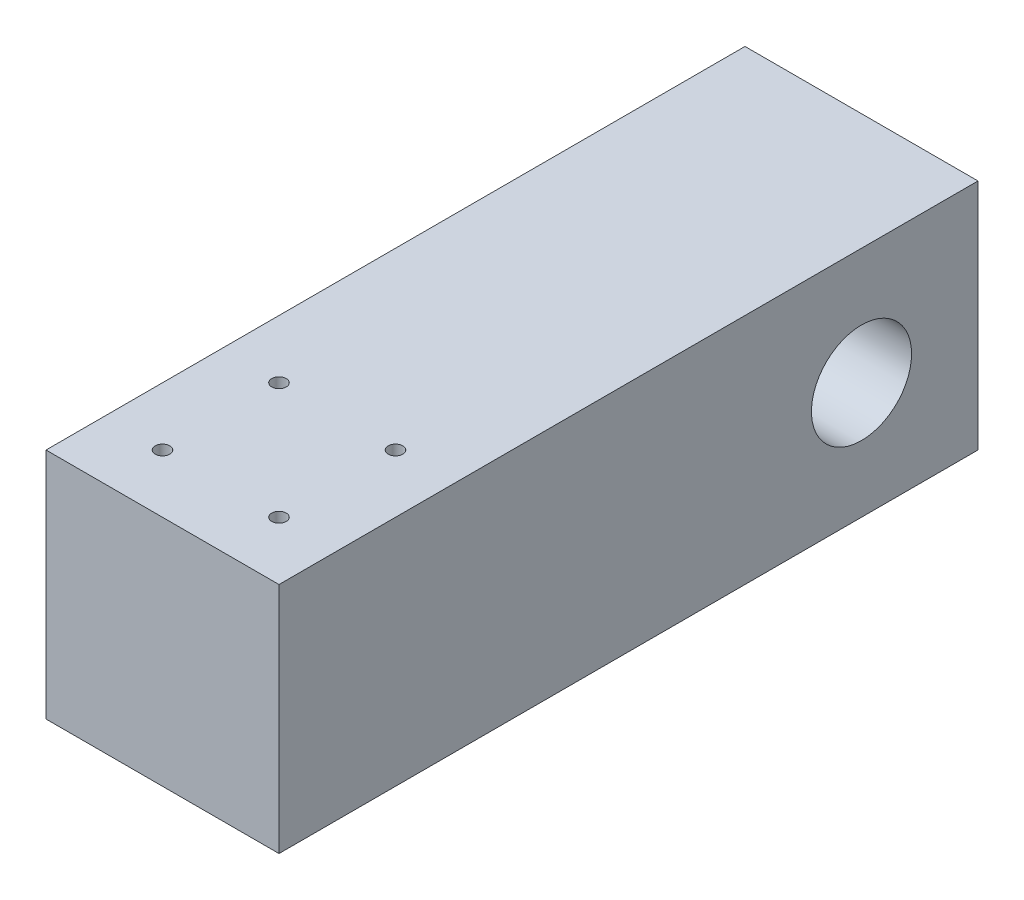
ISO-10303-21;
HEADER;
FILE_DESCRIPTION(('STEP AP214'),'2;1');
FILE_NAME('part.step','',(''),(''),'','','');
FILE_SCHEMA(('AUTOMOTIVE_DESIGN { 1 0 10303 214 1 1 1 1 }'));
ENDSEC;
DATA;
#1=APPLICATION_CONTEXT('core data for automotive mechanical design processes');
#2=APPLICATION_PROTOCOL_DEFINITION('international standard','automotive_design',2000,#1);
#3=PRODUCT_CONTEXT('',#1,'mechanical');
#4=PRODUCT('Part','Part','',(#3));
#5=PRODUCT_RELATED_PRODUCT_CATEGORY('part','',(#4));
#6=PRODUCT_DEFINITION_FORMATION('','',#4);
#7=PRODUCT_DEFINITION_CONTEXT('part definition',#1,'design');
#8=PRODUCT_DEFINITION('design','',#6,#7);
#9=PRODUCT_DEFINITION_SHAPE('','',#8);
#10=(LENGTH_UNIT() NAMED_UNIT(*) SI_UNIT(.MILLI.,.METRE.));
#11=(NAMED_UNIT(*) PLANE_ANGLE_UNIT() SI_UNIT($,.RADIAN.));
#12=(NAMED_UNIT(*) SI_UNIT($,.STERADIAN.) SOLID_ANGLE_UNIT());
#13=UNCERTAINTY_MEASURE_WITH_UNIT(LENGTH_MEASURE(1.E-05),#10,'distance_accuracy_value','');
#14=(GEOMETRIC_REPRESENTATION_CONTEXT(3) GLOBAL_UNCERTAINTY_ASSIGNED_CONTEXT((#13)) GLOBAL_UNIT_ASSIGNED_CONTEXT((#10,
#11,#12)) REPRESENTATION_CONTEXT('',''));
#15=CARTESIAN_POINT('',(0.,0.,0.));
#16=DIRECTION('',(0.,0.,1.));
#17=DIRECTION('',(1.,0.,0.));
#18=AXIS2_PLACEMENT_3D('',#15,#16,#17);
#19=CARTESIAN_POINT('',(50.8,0.,0.));
#20=DIRECTION('',(0.,0.,-1.));
#21=DIRECTION('',(-1.,0.,0.));
#22=AXIS2_PLACEMENT_3D('',#19,#20,#21);
#23=PLANE('',#22);
#24=DIRECTION('',(0.,-1.,0.));
#25=VECTOR('',#24,1.);
#26=CARTESIAN_POINT('',(0.,0.,0.));
#27=LINE('',#26,#25);
#28=CARTESIAN_POINT('',(0.,50.8,0.));
#29=VERTEX_POINT('',#28);
#30=CARTESIAN_POINT('',(0.,0.,0.));
#31=VERTEX_POINT('',#30);
#32=EDGE_CURVE('E99',#29,#31,#27,.T.);
#33=ORIENTED_EDGE('',*,*,#32,.T.);
#34=DIRECTION('',(-1.,0.,0.));
#35=VECTOR('',#34,1.);
#36=CARTESIAN_POINT('',(50.8,0.,0.));
#37=LINE('',#36,#35);
#38=CARTESIAN_POINT('',(50.8,0.,0.));
#39=VERTEX_POINT('',#38);
#40=EDGE_CURVE('E11',#39,#31,#37,.T.);
#41=ORIENTED_EDGE('',*,*,#40,.F.);
#42=DIRECTION('',(0.,-1.,0.));
#43=VECTOR('',#42,1.);
#44=CARTESIAN_POINT('',(50.8,0.,0.));
#45=LINE('',#44,#43);
#46=CARTESIAN_POINT('',(50.8,50.8,0.));
#47=VERTEX_POINT('',#46);
#48=EDGE_CURVE('E87',#47,#39,#45,.T.);
#49=ORIENTED_EDGE('',*,*,#48,.F.);
#50=DIRECTION('',(-1.,0.,0.));
#51=VECTOR('',#50,1.);
#52=CARTESIAN_POINT('',(50.8,50.8,0.));
#53=LINE('',#52,#51);
#54=EDGE_CURVE('E95',#47,#29,#53,.T.);
#55=ORIENTED_EDGE('',*,*,#54,.T.);
#56=EDGE_LOOP('',(#33,#41,#49,#55));
#57=FACE_BOUND('',#56,.T.);
#58=ADVANCED_FACE('F36',(#57),#23,.F.);
#59=CARTESIAN_POINT('',(50.8,0.,0.));
#60=DIRECTION('',(0.,1.,0.));
#61=DIRECTION('',(0.,0.,1.));
#62=AXIS2_PLACEMENT_3D('',#59,#60,#61);
#63=PLANE('',#62);
#64=CARTESIAN_POINT('',(38.1,0.,-38.1));
#65=DIRECTION('',(0.,1.,0.));
#66=DIRECTION('',(0.,0.,1.));
#67=AXIS2_PLACEMENT_3D('',#64,#65,#66);
#68=CIRCLE('',#67,1.5875);
#69=CARTESIAN_POINT('',(38.1,0.,-36.5125));
#70=VERTEX_POINT('',#69);
#71=EDGE_CURVE('E122',#70,#70,#68,.T.);
#72=ORIENTED_EDGE('',*,*,#71,.T.);
#73=EDGE_LOOP('',(#72));
#74=FACE_BOUND('',#73,.T.);
#75=CARTESIAN_POINT('',(12.7,0.,-12.7));
#76=DIRECTION('',(0.,1.,0.));
#77=DIRECTION('',(0.,0.,1.));
#78=AXIS2_PLACEMENT_3D('',#75,#76,#77);
#79=CIRCLE('',#78,1.5875);
#80=CARTESIAN_POINT('',(12.7,0.,-11.1125));
#81=VERTEX_POINT('',#80);
#82=EDGE_CURVE('E128',#81,#81,#79,.T.);
#83=ORIENTED_EDGE('',*,*,#82,.T.);
#84=EDGE_LOOP('',(#83));
#85=FACE_BOUND('',#84,.T.);
#86=CARTESIAN_POINT('',(38.1,0.,-12.7));
#87=DIRECTION('',(0.,1.,0.));
#88=DIRECTION('',(0.,0.,1.));
#89=AXIS2_PLACEMENT_3D('',#86,#87,#88);
#90=CIRCLE('',#89,1.5875);
#91=CARTESIAN_POINT('',(38.1,0.,-11.1125));
#92=VERTEX_POINT('',#91);
#93=EDGE_CURVE('E129',#92,#92,#90,.T.);
#94=ORIENTED_EDGE('',*,*,#93,.T.);
#95=EDGE_LOOP('',(#94));
#96=FACE_BOUND('',#95,.T.);
#97=CARTESIAN_POINT('',(12.7,0.,-38.1));
#98=DIRECTION('',(0.,1.,0.));
#99=DIRECTION('',(0.,0.,1.));
#100=AXIS2_PLACEMENT_3D('',#97,#98,#99);
#101=CIRCLE('',#100,1.5875);
#102=CARTESIAN_POINT('',(12.7,0.,-36.5125));
#103=VERTEX_POINT('',#102);
#104=EDGE_CURVE('E116',#103,#103,#101,.T.);
#105=ORIENTED_EDGE('',*,*,#104,.T.);
#106=EDGE_LOOP('',(#105));
#107=FACE_BOUND('',#106,.T.);
#108=DIRECTION('',(0.,0.,-1.));
#109=VECTOR('',#108,1.);
#110=CARTESIAN_POINT('',(0.,0.,0.));
#111=LINE('',#110,#109);
#112=CARTESIAN_POINT('',(0.,0.,-152.4));
#113=VERTEX_POINT('',#112);
#114=EDGE_CURVE('E91',#31,#113,#111,.T.);
#115=ORIENTED_EDGE('',*,*,#114,.T.);
#116=DIRECTION('',(-1.,0.,0.));
#117=VECTOR('',#116,1.);
#118=CARTESIAN_POINT('',(50.8,0.,-152.4));
#119=LINE('',#118,#117);
#120=CARTESIAN_POINT('',(50.8,0.,-152.4));
#121=VERTEX_POINT('',#120);
#122=EDGE_CURVE('E44',#121,#113,#119,.T.);
#123=ORIENTED_EDGE('',*,*,#122,.F.);
#124=DIRECTION('',(0.,0.,-1.));
#125=VECTOR('',#124,1.);
#126=CARTESIAN_POINT('',(50.8,0.,0.));
#127=LINE('',#126,#125);
#128=EDGE_CURVE('E82',#39,#121,#127,.T.);
#129=ORIENTED_EDGE('',*,*,#128,.F.);
#130=ORIENTED_EDGE('',*,*,#40,.T.);
#131=EDGE_LOOP('',(#115,#123,#129,#130));
#132=FACE_BOUND('',#131,.T.);
#133=ADVANCED_FACE('F90',(#74,#85,#96,#107,#132),#63,.F.);
#134=CARTESIAN_POINT('',(50.8,0.,-152.4));
#135=DIRECTION('',(0.,0.,1.));
#136=DIRECTION('',(1.,0.,0.));
#137=AXIS2_PLACEMENT_3D('',#134,#135,#136);
#138=PLANE('',#137);
#139=DIRECTION('',(0.,1.,0.));
#140=VECTOR('',#139,1.);
#141=CARTESIAN_POINT('',(0.,0.,-152.4));
#142=LINE('',#141,#140);
#143=CARTESIAN_POINT('',(0.,50.8,-152.4));
#144=VERTEX_POINT('',#143);
#145=EDGE_CURVE('E69',#113,#144,#142,.T.);
#146=ORIENTED_EDGE('',*,*,#145,.T.);
#147=DIRECTION('',(-1.,0.,0.));
#148=VECTOR('',#147,1.);
#149=CARTESIAN_POINT('',(50.8,50.8,-152.4));
#150=LINE('',#149,#148);
#151=CARTESIAN_POINT('',(50.8,50.8,-152.4));
#152=VERTEX_POINT('',#151);
#153=EDGE_CURVE('E92',#152,#144,#150,.T.);
#154=ORIENTED_EDGE('',*,*,#153,.F.);
#155=DIRECTION('',(0.,1.,0.));
#156=VECTOR('',#155,1.);
#157=CARTESIAN_POINT('',(50.8,0.,-152.4));
#158=LINE('',#157,#156);
#159=EDGE_CURVE('E85',#121,#152,#158,.T.);
#160=ORIENTED_EDGE('',*,*,#159,.F.);
#161=ORIENTED_EDGE('',*,*,#122,.T.);
#162=EDGE_LOOP('',(#146,#154,#160,#161));
#163=FACE_BOUND('',#162,.T.);
#164=ADVANCED_FACE('F93',(#163),#138,.F.);
#165=CARTESIAN_POINT('',(50.8,50.8,0.));
#166=DIRECTION('',(0.,-1.,0.));
#167=DIRECTION('',(0.,0.,-1.));
#168=AXIS2_PLACEMENT_3D('',#165,#166,#167);
#169=PLANE('',#168);
#170=CARTESIAN_POINT('',(38.1,50.8,-38.1));
#171=DIRECTION('',(0.,1.,0.));
#172=DIRECTION('',(0.,0.,1.));
#173=AXIS2_PLACEMENT_3D('',#170,#171,#172);
#174=CIRCLE('',#173,1.5875);
#175=CARTESIAN_POINT('',(38.1,50.8,-36.5125));
#176=VERTEX_POINT('',#175);
#177=EDGE_CURVE('E132',#176,#176,#174,.T.);
#178=ORIENTED_EDGE('',*,*,#177,.F.);
#179=EDGE_LOOP('',(#178));
#180=FACE_BOUND('',#179,.T.);
#181=CARTESIAN_POINT('',(12.7,50.8,-12.7));
#182=DIRECTION('',(0.,1.,0.));
#183=DIRECTION('',(0.,0.,1.));
#184=AXIS2_PLACEMENT_3D('',#181,#182,#183);
#185=CIRCLE('',#184,1.5875);
#186=CARTESIAN_POINT('',(12.7,50.8,-11.1125));
#187=VERTEX_POINT('',#186);
#188=EDGE_CURVE('E125',#187,#187,#185,.T.);
#189=ORIENTED_EDGE('',*,*,#188,.F.);
#190=EDGE_LOOP('',(#189));
#191=FACE_BOUND('',#190,.T.);
#192=CARTESIAN_POINT('',(38.1,50.8,-12.7));
#193=DIRECTION('',(0.,1.,0.));
#194=DIRECTION('',(0.,0.,1.));
#195=AXIS2_PLACEMENT_3D('',#192,#193,#194);
#196=CIRCLE('',#195,1.5875);
#197=CARTESIAN_POINT('',(38.1,50.8,-11.1125));
#198=VERTEX_POINT('',#197);
#199=EDGE_CURVE('E137',#198,#198,#196,.T.);
#200=ORIENTED_EDGE('',*,*,#199,.F.);
#201=EDGE_LOOP('',(#200));
#202=FACE_BOUND('',#201,.T.);
#203=CARTESIAN_POINT('',(12.7,50.8,-38.1));
#204=DIRECTION('',(0.,1.,0.));
#205=DIRECTION('',(0.,0.,1.));
#206=AXIS2_PLACEMENT_3D('',#203,#204,#205);
#207=CIRCLE('',#206,1.5875);
#208=CARTESIAN_POINT('',(12.7,50.8,-36.5125));
#209=VERTEX_POINT('',#208);
#210=EDGE_CURVE('E119',#209,#209,#207,.T.);
#211=ORIENTED_EDGE('',*,*,#210,.F.);
#212=EDGE_LOOP('',(#211));
#213=FACE_BOUND('',#212,.T.);
#214=DIRECTION('',(0.,0.,1.));
#215=VECTOR('',#214,1.);
#216=CARTESIAN_POINT('',(0.,50.8,0.));
#217=LINE('',#216,#215);
#218=EDGE_CURVE('E75',#144,#29,#217,.T.);
#219=ORIENTED_EDGE('',*,*,#218,.T.);
#220=ORIENTED_EDGE('',*,*,#54,.F.);
#221=DIRECTION('',(0.,0.,1.));
#222=VECTOR('',#221,1.);
#223=CARTESIAN_POINT('',(50.8,50.8,0.));
#224=LINE('',#223,#222);
#225=EDGE_CURVE('E52',#152,#47,#224,.T.);
#226=ORIENTED_EDGE('',*,*,#225,.F.);
#227=ORIENTED_EDGE('',*,*,#153,.T.);
#228=EDGE_LOOP('',(#219,#220,#226,#227));
#229=FACE_BOUND('',#228,.T.);
#230=ADVANCED_FACE('F107',(#180,#191,#202,#213,#229),#169,.F.);
#231=CARTESIAN_POINT('',(50.8,0.,0.));
#232=DIRECTION('',(-1.,0.,0.));
#233=DIRECTION('',(0.,0.,1.));
#234=AXIS2_PLACEMENT_3D('',#231,#232,#233);
#235=PLANE('',#234);
#236=CARTESIAN_POINT('',(50.8,25.4,-127.));
#237=DIRECTION('',(1.,0.,0.));
#238=DIRECTION('',(0.,0.,-1.));
#239=AXIS2_PLACEMENT_3D('',#236,#237,#238);
#240=CIRCLE('',#239,10.9140625);
#241=CARTESIAN_POINT('',(50.8,25.4,-137.9140625));
#242=VERTEX_POINT('',#241);
#243=EDGE_CURVE('E113',#242,#242,#240,.T.);
#244=ORIENTED_EDGE('',*,*,#243,.F.);
#245=EDGE_LOOP('',(#244));
#246=FACE_BOUND('',#245,.T.);
#247=ORIENTED_EDGE('',*,*,#48,.T.);
#248=ORIENTED_EDGE('',*,*,#128,.T.);
#249=ORIENTED_EDGE('',*,*,#159,.T.);
#250=ORIENTED_EDGE('',*,*,#225,.T.);
#251=EDGE_LOOP('',(#247,#248,#249,#250));
#252=FACE_BOUND('',#251,.T.);
#253=ADVANCED_FACE('F83',(#246,#252),#235,.F.);
#254=CARTESIAN_POINT('',(0.,0.,0.));
#255=DIRECTION('',(-1.,0.,0.));
#256=DIRECTION('',(0.,0.,1.));
#257=AXIS2_PLACEMENT_3D('',#254,#255,#256);
#258=PLANE('',#257);
#259=CARTESIAN_POINT('',(0.,25.4,-127.));
#260=DIRECTION('',(1.,0.,0.));
#261=DIRECTION('',(0.,0.,-1.));
#262=AXIS2_PLACEMENT_3D('',#259,#260,#261);
#263=CIRCLE('',#262,10.9140625);
#264=CARTESIAN_POINT('',(0.,25.4,-137.9140625));
#265=VERTEX_POINT('',#264);
#266=EDGE_CURVE('E102',#265,#265,#263,.T.);
#267=ORIENTED_EDGE('',*,*,#266,.T.);
#268=EDGE_LOOP('',(#267));
#269=FACE_BOUND('',#268,.T.);
#270=ORIENTED_EDGE('',*,*,#32,.F.);
#271=ORIENTED_EDGE('',*,*,#218,.F.);
#272=ORIENTED_EDGE('',*,*,#145,.F.);
#273=ORIENTED_EDGE('',*,*,#114,.F.);
#274=EDGE_LOOP('',(#270,#271,#272,#273));
#275=FACE_BOUND('',#274,.T.);
#276=ADVANCED_FACE('F110',(#269,#275),#258,.T.);
#277=CARTESIAN_POINT('',(0.,25.4,-127.));
#278=DIRECTION('',(1.,0.,0.));
#279=DIRECTION('',(0.,0.,-1.));
#280=AXIS2_PLACEMENT_3D('',#277,#278,#279);
#281=CYLINDRICAL_SURFACE('',#280,10.9140625);
#282=ORIENTED_EDGE('',*,*,#266,.F.);
#283=EDGE_LOOP('',(#282));
#284=FACE_BOUND('',#283,.T.);
#285=ORIENTED_EDGE('',*,*,#243,.T.);
#286=EDGE_LOOP('',(#285));
#287=FACE_BOUND('',#286,.T.);
#288=ADVANCED_FACE('F160',(#284,#287),#281,.F.);
#289=CARTESIAN_POINT('',(12.7,0.,-38.1));
#290=DIRECTION('',(0.,1.,0.));
#291=DIRECTION('',(0.,0.,1.));
#292=AXIS2_PLACEMENT_3D('',#289,#290,#291);
#293=CYLINDRICAL_SURFACE('',#292,1.5875);
#294=ORIENTED_EDGE('',*,*,#104,.F.);
#295=EDGE_LOOP('',(#294));
#296=FACE_BOUND('',#295,.T.);
#297=ORIENTED_EDGE('',*,*,#210,.T.);
#298=EDGE_LOOP('',(#297));
#299=FACE_BOUND('',#298,.T.);
#300=ADVANCED_FACE('F149',(#296,#299),#293,.F.);
#301=CARTESIAN_POINT('',(38.1,0.,-12.7));
#302=DIRECTION('',(0.,1.,0.));
#303=DIRECTION('',(0.,0.,1.));
#304=AXIS2_PLACEMENT_3D('',#301,#302,#303);
#305=CYLINDRICAL_SURFACE('',#304,1.5875);
#306=ORIENTED_EDGE('',*,*,#93,.F.);
#307=EDGE_LOOP('',(#306));
#308=FACE_BOUND('',#307,.T.);
#309=ORIENTED_EDGE('',*,*,#199,.T.);
#310=EDGE_LOOP('',(#309));
#311=FACE_BOUND('',#310,.T.);
#312=ADVANCED_FACE('F145',(#308,#311),#305,.F.);
#313=CARTESIAN_POINT('',(12.7,0.,-12.7));
#314=DIRECTION('',(0.,1.,0.));
#315=DIRECTION('',(0.,0.,1.));
#316=AXIS2_PLACEMENT_3D('',#313,#314,#315);
#317=CYLINDRICAL_SURFACE('',#316,1.5875);
#318=ORIENTED_EDGE('',*,*,#82,.F.);
#319=EDGE_LOOP('',(#318));
#320=FACE_BOUND('',#319,.T.);
#321=ORIENTED_EDGE('',*,*,#188,.T.);
#322=EDGE_LOOP('',(#321));
#323=FACE_BOUND('',#322,.T.);
#324=ADVANCED_FACE('F148',(#320,#323),#317,.F.);
#325=CARTESIAN_POINT('',(38.1,0.,-38.1));
#326=DIRECTION('',(0.,1.,0.));
#327=DIRECTION('',(0.,0.,1.));
#328=AXIS2_PLACEMENT_3D('',#325,#326,#327);
#329=CYLINDRICAL_SURFACE('',#328,1.5875);
#330=ORIENTED_EDGE('',*,*,#71,.F.);
#331=EDGE_LOOP('',(#330));
#332=FACE_BOUND('',#331,.T.);
#333=ORIENTED_EDGE('',*,*,#177,.T.);
#334=EDGE_LOOP('',(#333));
#335=FACE_BOUND('',#334,.T.);
#336=ADVANCED_FACE('F213',(#332,#335),#329,.F.);
#337=CLOSED_SHELL('',(#58,#133,#164,#230,#253,#276,#288,#300,#312,#324,#336));
#338=MANIFOLD_SOLID_BREP('B2',#337);
#339=ADVANCED_BREP_SHAPE_REPRESENTATION('',(#18,#338),#14);
#340=SHAPE_DEFINITION_REPRESENTATION(#9,#339);
ENDSEC;
END-ISO-10303-21;
